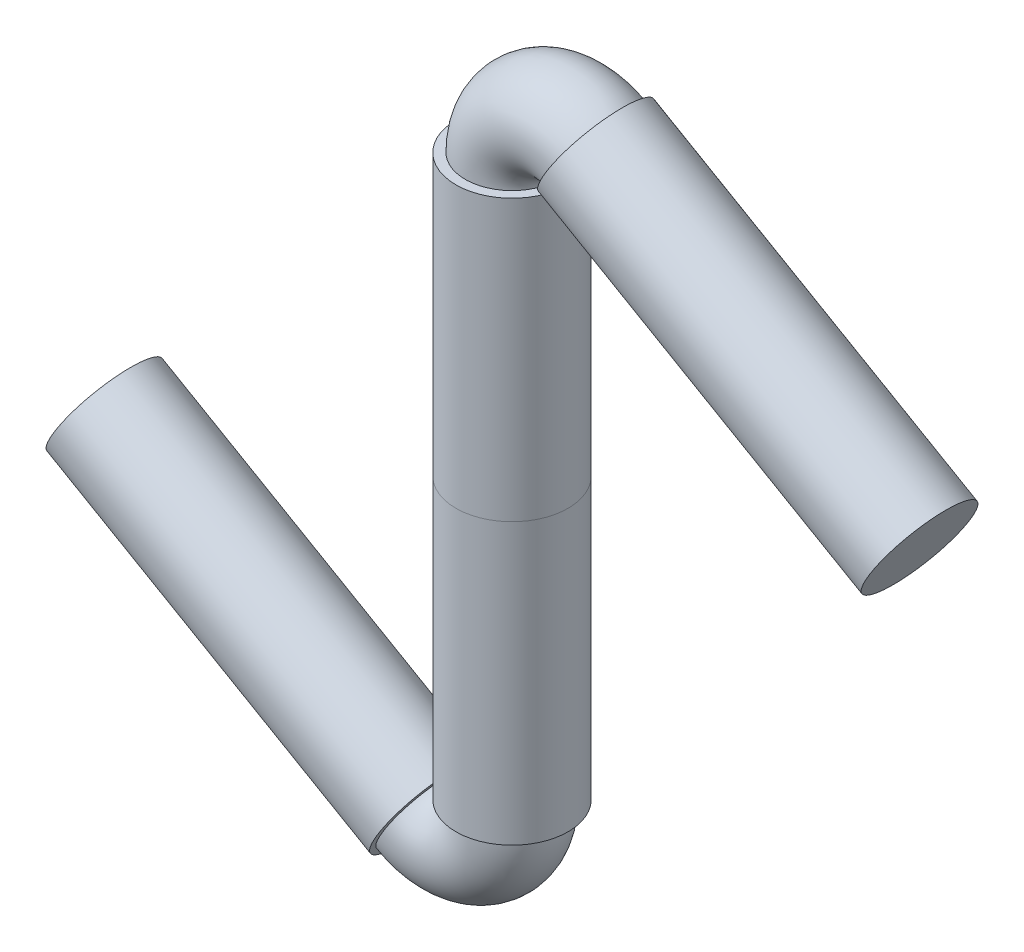
ISO-10303-21;
HEADER;
FILE_DESCRIPTION(('STEP AP214'),'2;1');
FILE_NAME('part.step','',(''),(''),'','','');
FILE_SCHEMA(('AUTOMOTIVE_DESIGN { 1 0 10303 214 1 1 1 1 }'));
ENDSEC;
DATA;
#1=APPLICATION_CONTEXT('core data for automotive mechanical design processes');
#2=APPLICATION_PROTOCOL_DEFINITION('international standard','automotive_design',2000,#1);
#3=PRODUCT_CONTEXT('',#1,'mechanical');
#4=PRODUCT('Part','Part','',(#3));
#5=PRODUCT_RELATED_PRODUCT_CATEGORY('part','',(#4));
#6=PRODUCT_DEFINITION_FORMATION('','',#4);
#7=PRODUCT_DEFINITION_CONTEXT('part definition',#1,'design');
#8=PRODUCT_DEFINITION('design','',#6,#7);
#9=PRODUCT_DEFINITION_SHAPE('','',#8);
#10=(LENGTH_UNIT() NAMED_UNIT(*) SI_UNIT(.MILLI.,.METRE.));
#11=(NAMED_UNIT(*) PLANE_ANGLE_UNIT() SI_UNIT($,.RADIAN.));
#12=(NAMED_UNIT(*) SI_UNIT($,.STERADIAN.) SOLID_ANGLE_UNIT());
#13=UNCERTAINTY_MEASURE_WITH_UNIT(LENGTH_MEASURE(1.E-05),#10,'distance_accuracy_value','');
#14=(GEOMETRIC_REPRESENTATION_CONTEXT(3) GLOBAL_UNCERTAINTY_ASSIGNED_CONTEXT((#13)) GLOBAL_UNIT_ASSIGNED_CONTEXT((#10,
#11,#12)) REPRESENTATION_CONTEXT('',''));
#15=CARTESIAN_POINT('',(0.,0.,0.));
#16=DIRECTION('',(0.,0.,1.));
#17=DIRECTION('',(1.,0.,0.));
#18=AXIS2_PLACEMENT_3D('',#15,#16,#17);
#19=CARTESIAN_POINT('',(0.,-75.,0.));
#20=DIRECTION('',(0.,1.,0.));
#21=DIRECTION('',(0.,0.,-1.));
#22=AXIS2_PLACEMENT_3D('',#19,#20,#21);
#23=CYLINDRICAL_SURFACE('',#22,15.);
#24=CARTESIAN_POINT('',(0.,-75.,0.));
#25=DIRECTION('',(0.,-1.,0.));
#26=DIRECTION('',(0.,0.,1.));
#27=AXIS2_PLACEMENT_3D('',#24,#25,#26);
#28=CIRCLE('',#27,15.);
#29=CARTESIAN_POINT('',(0.,-75.,15.));
#30=VERTEX_POINT('',#29);
#31=EDGE_CURVE('E11',#30,#30,#28,.T.);
#32=ORIENTED_EDGE('',*,*,#31,.F.);
#33=EDGE_LOOP('',(#32));
#34=FACE_BOUND('',#33,.T.);
#35=CARTESIAN_POINT('',(0.,0.,0.));
#36=DIRECTION('',(0.,-1.,0.));
#37=DIRECTION('',(0.,0.,1.));
#38=AXIS2_PLACEMENT_3D('',#35,#36,#37);
#39=CIRCLE('',#38,15.);
#40=CARTESIAN_POINT('',(0.,0.,15.));
#41=VERTEX_POINT('',#40);
#42=EDGE_CURVE('E50',#41,#41,#39,.T.);
#43=ORIENTED_EDGE('',*,*,#42,.T.);
#44=EDGE_LOOP('',(#43));
#45=FACE_BOUND('',#44,.T.);
#46=ADVANCED_FACE('F47',(#34,#45),#23,.T.);
#47=CARTESIAN_POINT('',(0.,-75.,0.));
#48=DIRECTION('',(0.,-1.,0.));
#49=DIRECTION('',(0.,0.,1.));
#50=AXIS2_PLACEMENT_3D('',#47,#48,#49);
#51=PLANE('',#50);
#52=CARTESIAN_POINT('',(0.,-75.,0.));
#53=DIRECTION('',(0.,1.,0.));
#54=DIRECTION('',(-1.,0.,0.));
#55=AXIS2_PLACEMENT_3D('',#52,#53,#54);
#56=CIRCLE('',#55,12.5);
#57=CARTESIAN_POINT('',(12.5,-75.0000000000001,0.));
#58=VERTEX_POINT('',#57);
#59=EDGE_CURVE('E57',#58,#58,#56,.T.);
#60=ORIENTED_EDGE('',*,*,#59,.T.);
#61=EDGE_LOOP('',(#60));
#62=FACE_BOUND('',#61,.T.);
#63=ORIENTED_EDGE('',*,*,#31,.T.);
#64=EDGE_LOOP('',(#63));
#65=FACE_BOUND('',#64,.T.);
#66=ADVANCED_FACE('F89',(#62,#65),#51,.T.);
#67=CARTESIAN_POINT('',(0.,0.,0.));
#68=DIRECTION('',(0.,-1.,0.));
#69=DIRECTION('',(0.,0.,1.));
#70=AXIS2_PLACEMENT_3D('',#67,#68,#69);
#71=PLANE('',#70);
#72=ORIENTED_EDGE('',*,*,#42,.F.);
#73=EDGE_LOOP('',(#72));
#74=FACE_BOUND('',#73,.T.);
#75=ADVANCED_FACE('F94',(#74),#71,.F.);
#76=CARTESIAN_POINT('',(-15.,-75.,0.));
#77=DIRECTION('',(0.,0.,-1.));
#78=DIRECTION('',(1.,0.,0.));
#79=AXIS2_PLACEMENT_3D('',#76,#77,#78);
#80=TOROIDAL_SURFACE('',#79,15.,12.5);
#81=CARTESIAN_POINT('',(-22.4999999999999,-87.9903810567666,0.));
#82=DIRECTION('',(-0.86602540378444,0.499999999999998,0.));
#83=DIRECTION('',(-0.499999999999998,-0.86602540378444,0.));
#84=AXIS2_PLACEMENT_3D('',#81,#82,#83);
#85=CIRCLE('',#84,12.5);
#86=CARTESIAN_POINT('',(-28.7499999999999,-98.8156986040721,0.));
#87=VERTEX_POINT('',#86);
#88=EDGE_CURVE('E61',#87,#87,#85,.T.);
#89=CARTESIAN_POINT('',(-15.,-75.,0.));
#90=DIRECTION('',(0.,0.,-1.));
#91=DIRECTION('',(1.,0.,0.));
#92=AXIS2_PLACEMENT_3D('',#89,#90,#91);
#93=CIRCLE('',#92,27.5);
#94=EDGE_CURVE('',#58,#87,#93,.T.);
#95=ORIENTED_EDGE('',*,*,#59,.F.);
#96=ORIENTED_EDGE('',*,*,#88,.F.);
#97=ORIENTED_EDGE('',*,*,#94,.T.);
#98=ORIENTED_EDGE('',*,*,#94,.F.);
#99=EDGE_LOOP('',(#95,#97,#96,#98));
#100=FACE_BOUND('',#99,.T.);
#101=ADVANCED_FACE('F76',(#100),#80,.T.);
#102=CARTESIAN_POINT('',(-109.102540378444,-37.9903810567668,0.));
#103=DIRECTION('',(0.86602540378444,-0.499999999999998,0.));
#104=DIRECTION('',(0.499999999999998,0.86602540378444,0.));
#105=AXIS2_PLACEMENT_3D('',#102,#103,#104);
#106=CYLINDRICAL_SURFACE('',#105,14.);
#107=CARTESIAN_POINT('',(-109.102540378444,-37.9903810567668,0.));
#108=DIRECTION('',(-0.86602540378444,0.499999999999998,0.));
#109=DIRECTION('',(-0.499999999999998,-0.86602540378444,0.));
#110=AXIS2_PLACEMENT_3D('',#107,#108,#109);
#111=CIRCLE('',#110,14.);
#112=CARTESIAN_POINT('',(-116.102540378444,-50.114736709749,0.));
#113=VERTEX_POINT('',#112);
#114=EDGE_CURVE('E64',#113,#113,#111,.T.);
#115=ORIENTED_EDGE('',*,*,#114,.F.);
#116=EDGE_LOOP('',(#115));
#117=FACE_BOUND('',#116,.T.);
#118=CARTESIAN_POINT('',(-22.5,-87.9903810567666,0.));
#119=DIRECTION('',(-0.86602540378444,0.499999999999998,0.));
#120=DIRECTION('',(-0.499999999999998,-0.86602540378444,0.));
#121=AXIS2_PLACEMENT_3D('',#118,#119,#120);
#122=CIRCLE('',#121,14.);
#123=CARTESIAN_POINT('',(-29.4999999999999,-100.114736709749,0.));
#124=VERTEX_POINT('',#123);
#125=EDGE_CURVE('E65',#124,#124,#122,.T.);
#126=ORIENTED_EDGE('',*,*,#125,.T.);
#127=EDGE_LOOP('',(#126));
#128=FACE_BOUND('',#127,.T.);
#129=ADVANCED_FACE('F73',(#117,#128),#106,.T.);
#130=CARTESIAN_POINT('',(-109.102540378444,-37.9903810567668,0.));
#131=DIRECTION('',(-0.86602540378444,0.499999999999998,0.));
#132=DIRECTION('',(-0.499999999999998,-0.86602540378444,0.));
#133=AXIS2_PLACEMENT_3D('',#130,#131,#132);
#134=PLANE('',#133);
#135=ORIENTED_EDGE('',*,*,#114,.T.);
#136=EDGE_LOOP('',(#135));
#137=FACE_BOUND('',#136,.T.);
#138=ADVANCED_FACE('F71',(#137),#134,.T.);
#139=CARTESIAN_POINT('',(-22.5,-87.9903810567666,0.));
#140=DIRECTION('',(-0.86602540378444,0.499999999999998,0.));
#141=DIRECTION('',(-0.499999999999998,-0.86602540378444,0.));
#142=AXIS2_PLACEMENT_3D('',#139,#140,#141);
#143=PLANE('',#142);
#144=ORIENTED_EDGE('',*,*,#88,.T.);
#145=EDGE_LOOP('',(#144));
#146=FACE_BOUND('',#145,.T.);
#147=ORIENTED_EDGE('',*,*,#125,.F.);
#148=EDGE_LOOP('',(#147));
#149=FACE_BOUND('',#148,.T.);
#150=ADVANCED_FACE('F80',(#146,#149),#143,.F.);
#151=CLOSED_SHELL('',(#46,#66,#75,#101,#129,#138,#150));
#152=MANIFOLD_SOLID_BREP('B2',#151);
#153=CARTESIAN_POINT('',(0.,75.,0.));
#154=DIRECTION('',(0.,-1.,0.));
#155=DIRECTION('',(0.,0.,-1.));
#156=AXIS2_PLACEMENT_3D('',#153,#154,#155);
#157=CYLINDRICAL_SURFACE('',#156,15.);
#158=CARTESIAN_POINT('',(0.,75.,0.));
#159=DIRECTION('',(0.,1.,0.));
#160=DIRECTION('',(0.,0.,1.));
#161=AXIS2_PLACEMENT_3D('',#158,#159,#160);
#162=CIRCLE('',#161,15.);
#163=CARTESIAN_POINT('',(0.,75.,15.));
#164=VERTEX_POINT('',#163);
#165=EDGE_CURVE('E46',#164,#164,#162,.T.);
#166=ORIENTED_EDGE('',*,*,#165,.F.);
#167=EDGE_LOOP('',(#166));
#168=FACE_BOUND('',#167,.T.);
#169=CARTESIAN_POINT('',(0.,0.,0.));
#170=DIRECTION('',(0.,1.,0.));
#171=DIRECTION('',(0.,0.,1.));
#172=AXIS2_PLACEMENT_3D('',#169,#170,#171);
#173=CIRCLE('',#172,15.);
#174=CARTESIAN_POINT('',(0.,0.,15.));
#175=VERTEX_POINT('',#174);
#176=EDGE_CURVE('E153',#175,#175,#173,.T.);
#177=ORIENTED_EDGE('',*,*,#176,.T.);
#178=EDGE_LOOP('',(#177));
#179=FACE_BOUND('',#178,.T.);
#180=ADVANCED_FACE('F150',(#168,#179),#157,.T.);
#181=CARTESIAN_POINT('',(0.,75.,0.));
#182=DIRECTION('',(0.,1.,0.));
#183=DIRECTION('',(0.,0.,1.));
#184=AXIS2_PLACEMENT_3D('',#181,#182,#183);
#185=PLANE('',#184);
#186=CARTESIAN_POINT('',(0.,75.,0.));
#187=DIRECTION('',(0.,-1.,0.));
#188=DIRECTION('',(1.,0.,0.));
#189=AXIS2_PLACEMENT_3D('',#186,#187,#188);
#190=CIRCLE('',#189,12.5);
#191=CARTESIAN_POINT('',(-12.5,75.0000000000001,0.));
#192=VERTEX_POINT('',#191);
#193=EDGE_CURVE('E160',#192,#192,#190,.T.);
#194=ORIENTED_EDGE('',*,*,#193,.T.);
#195=EDGE_LOOP('',(#194));
#196=FACE_BOUND('',#195,.T.);
#197=ORIENTED_EDGE('',*,*,#165,.T.);
#198=EDGE_LOOP('',(#197));
#199=FACE_BOUND('',#198,.T.);
#200=ADVANCED_FACE('F192',(#196,#199),#185,.T.);
#201=CARTESIAN_POINT('',(0.,0.,0.));
#202=DIRECTION('',(0.,1.,0.));
#203=DIRECTION('',(0.,0.,1.));
#204=AXIS2_PLACEMENT_3D('',#201,#202,#203);
#205=PLANE('',#204);
#206=ORIENTED_EDGE('',*,*,#176,.F.);
#207=EDGE_LOOP('',(#206));
#208=FACE_BOUND('',#207,.T.);
#209=ADVANCED_FACE('F197',(#208),#205,.F.);
#210=CARTESIAN_POINT('',(15.,75.,0.));
#211=DIRECTION('',(0.,0.,-1.));
#212=DIRECTION('',(-1.,0.,0.));
#213=AXIS2_PLACEMENT_3D('',#210,#211,#212);
#214=TOROIDAL_SURFACE('',#213,15.,12.5);
#215=CARTESIAN_POINT('',(22.4999999999999,87.9903810567666,0.));
#216=DIRECTION('',(0.86602540378444,-0.499999999999998,0.));
#217=DIRECTION('',(0.499999999999998,0.86602540378444,0.));
#218=AXIS2_PLACEMENT_3D('',#215,#216,#217);
#219=CIRCLE('',#218,12.5);
#220=CARTESIAN_POINT('',(28.7499999999999,98.8156986040721,0.));
#221=VERTEX_POINT('',#220);
#222=EDGE_CURVE('E164',#221,#221,#219,.T.);
#223=CARTESIAN_POINT('',(15.,75.,0.));
#224=DIRECTION('',(0.,0.,-1.));
#225=DIRECTION('',(-1.,0.,0.));
#226=AXIS2_PLACEMENT_3D('',#223,#224,#225);
#227=CIRCLE('',#226,27.5);
#228=EDGE_CURVE('',#192,#221,#227,.T.);
#229=ORIENTED_EDGE('',*,*,#193,.F.);
#230=ORIENTED_EDGE('',*,*,#222,.F.);
#231=ORIENTED_EDGE('',*,*,#228,.T.);
#232=ORIENTED_EDGE('',*,*,#228,.F.);
#233=EDGE_LOOP('',(#229,#231,#230,#232));
#234=FACE_BOUND('',#233,.T.);
#235=ADVANCED_FACE('F179',(#234),#214,.T.);
#236=CARTESIAN_POINT('',(109.102540378444,37.9903810567668,0.));
#237=DIRECTION('',(-0.86602540378444,0.499999999999998,0.));
#238=DIRECTION('',(-0.499999999999998,-0.86602540378444,0.));
#239=AXIS2_PLACEMENT_3D('',#236,#237,#238);
#240=CYLINDRICAL_SURFACE('',#239,14.);
#241=CARTESIAN_POINT('',(109.102540378444,37.9903810567668,0.));
#242=DIRECTION('',(0.86602540378444,-0.499999999999998,0.));
#243=DIRECTION('',(0.499999999999998,0.86602540378444,0.));
#244=AXIS2_PLACEMENT_3D('',#241,#242,#243);
#245=CIRCLE('',#244,14.);
#246=CARTESIAN_POINT('',(116.102540378444,50.114736709749,0.));
#247=VERTEX_POINT('',#246);
#248=EDGE_CURVE('E167',#247,#247,#245,.T.);
#249=ORIENTED_EDGE('',*,*,#248,.F.);
#250=EDGE_LOOP('',(#249));
#251=FACE_BOUND('',#250,.T.);
#252=CARTESIAN_POINT('',(22.5,87.9903810567666,0.));
#253=DIRECTION('',(0.86602540378444,-0.499999999999998,0.));
#254=DIRECTION('',(0.499999999999998,0.86602540378444,0.));
#255=AXIS2_PLACEMENT_3D('',#252,#253,#254);
#256=CIRCLE('',#255,14.);
#257=CARTESIAN_POINT('',(29.4999999999999,100.114736709749,0.));
#258=VERTEX_POINT('',#257);
#259=EDGE_CURVE('E168',#258,#258,#256,.T.);
#260=ORIENTED_EDGE('',*,*,#259,.T.);
#261=EDGE_LOOP('',(#260));
#262=FACE_BOUND('',#261,.T.);
#263=ADVANCED_FACE('F176',(#251,#262),#240,.T.);
#264=CARTESIAN_POINT('',(109.102540378444,37.9903810567668,0.));
#265=DIRECTION('',(0.86602540378444,-0.499999999999998,0.));
#266=DIRECTION('',(0.499999999999998,0.86602540378444,0.));
#267=AXIS2_PLACEMENT_3D('',#264,#265,#266);
#268=PLANE('',#267);
#269=ORIENTED_EDGE('',*,*,#248,.T.);
#270=EDGE_LOOP('',(#269));
#271=FACE_BOUND('',#270,.T.);
#272=ADVANCED_FACE('F174',(#271),#268,.T.);
#273=CARTESIAN_POINT('',(22.5,87.9903810567666,0.));
#274=DIRECTION('',(0.86602540378444,-0.499999999999998,0.));
#275=DIRECTION('',(0.499999999999998,0.86602540378444,0.));
#276=AXIS2_PLACEMENT_3D('',#273,#274,#275);
#277=PLANE('',#276);
#278=ORIENTED_EDGE('',*,*,#222,.T.);
#279=EDGE_LOOP('',(#278));
#280=FACE_BOUND('',#279,.T.);
#281=ORIENTED_EDGE('',*,*,#259,.F.);
#282=EDGE_LOOP('',(#281));
#283=FACE_BOUND('',#282,.T.);
#284=ADVANCED_FACE('F183',(#280,#283),#277,.F.);
#285=CLOSED_SHELL('',(#180,#200,#209,#235,#263,#272,#284));
#286=MANIFOLD_SOLID_BREP('B6',#285);
#287=ADVANCED_BREP_SHAPE_REPRESENTATION('',(#18,#152,#286),#14);
#288=SHAPE_DEFINITION_REPRESENTATION(#9,#287);
ENDSEC;
END-ISO-10303-21;
